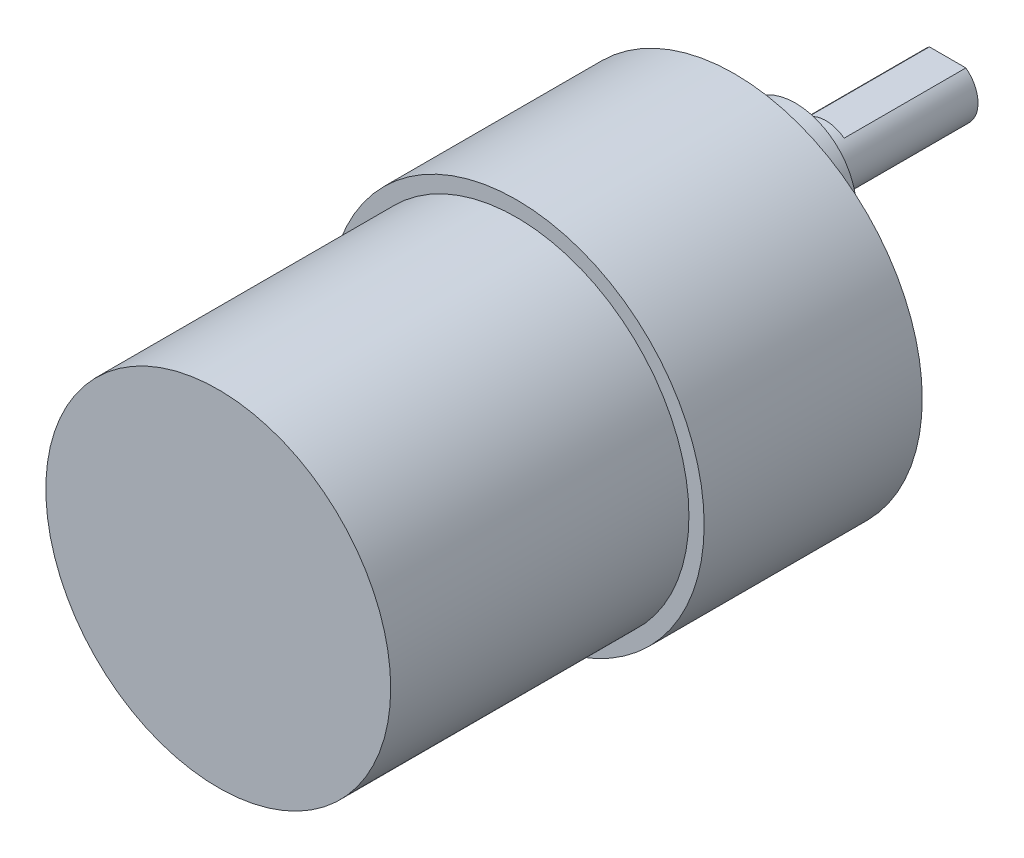
ISO-10303-21;
HEADER;
FILE_DESCRIPTION(('STEP AP214'),'2;1');
FILE_NAME('part.step','',(''),(''),'','','');
FILE_SCHEMA(('AUTOMOTIVE_DESIGN { 1 0 10303 214 1 1 1 1 }'));
ENDSEC;
DATA;
#1=APPLICATION_CONTEXT('core data for automotive mechanical design processes');
#2=APPLICATION_PROTOCOL_DEFINITION('international standard','automotive_design',2000,#1);
#3=PRODUCT_CONTEXT('',#1,'mechanical');
#4=PRODUCT('Part','Part','',(#3));
#5=PRODUCT_RELATED_PRODUCT_CATEGORY('part','',(#4));
#6=PRODUCT_DEFINITION_FORMATION('','',#4);
#7=PRODUCT_DEFINITION_CONTEXT('part definition',#1,'design');
#8=PRODUCT_DEFINITION('design','',#6,#7);
#9=PRODUCT_DEFINITION_SHAPE('','',#8);
#10=(LENGTH_UNIT() NAMED_UNIT(*) SI_UNIT(.MILLI.,.METRE.));
#11=(NAMED_UNIT(*) PLANE_ANGLE_UNIT() SI_UNIT($,.RADIAN.));
#12=(NAMED_UNIT(*) SI_UNIT($,.STERADIAN.) SOLID_ANGLE_UNIT());
#13=UNCERTAINTY_MEASURE_WITH_UNIT(LENGTH_MEASURE(1.E-05),#10,'distance_accuracy_value','');
#14=(GEOMETRIC_REPRESENTATION_CONTEXT(3) GLOBAL_UNCERTAINTY_ASSIGNED_CONTEXT((#13)) GLOBAL_UNIT_ASSIGNED_CONTEXT((#10,
#11,#12)) REPRESENTATION_CONTEXT('',''));
#15=CARTESIAN_POINT('',(0.,0.,0.));
#16=DIRECTION('',(0.,0.,1.));
#17=DIRECTION('',(1.,0.,0.));
#18=AXIS2_PLACEMENT_3D('',#15,#16,#17);
#19=CARTESIAN_POINT('',(0.,0.,0.));
#20=DIRECTION('',(0.,0.,1.));
#21=DIRECTION('',(1.,0.,0.));
#22=AXIS2_PLACEMENT_3D('',#19,#20,#21);
#23=PLANE('',#22);
#24=CARTESIAN_POINT('',(0.,-15.5,0.));
#25=DIRECTION('',(0.,0.,-1.));
#26=DIRECTION('',(-1.,0.,0.));
#27=AXIS2_PLACEMENT_3D('',#24,#25,#26);
#28=CIRCLE('',#27,2.);
#29=CARTESIAN_POINT('',(-2.,-15.5,0.));
#30=VERTEX_POINT('',#29);
#31=EDGE_CURVE('E435',#30,#30,#28,.T.);
#32=ORIENTED_EDGE('',*,*,#31,.F.);
#33=EDGE_LOOP('',(#32));
#34=FACE_BOUND('',#33,.T.);
#35=CARTESIAN_POINT('',(13.4233937586588,7.75000000000006,0.));
#36=DIRECTION('',(0.,0.,-1.));
#37=DIRECTION('',(-1.,0.,0.));
#38=AXIS2_PLACEMENT_3D('',#35,#36,#37);
#39=CIRCLE('',#38,2.);
#40=CARTESIAN_POINT('',(11.4233937586588,7.75000000000006,0.));
#41=VERTEX_POINT('',#40);
#42=EDGE_CURVE('E446',#41,#41,#39,.T.);
#43=ORIENTED_EDGE('',*,*,#42,.F.);
#44=EDGE_LOOP('',(#43));
#45=FACE_BOUND('',#44,.T.);
#46=CARTESIAN_POINT('',(-13.4233937586589,7.74999999999988,0.));
#47=DIRECTION('',(0.,0.,-1.));
#48=DIRECTION('',(-1.,0.,0.));
#49=AXIS2_PLACEMENT_3D('',#46,#47,#48);
#50=CIRCLE('',#49,2.);
#51=CARTESIAN_POINT('',(-15.4233937586589,7.74999999999988,0.));
#52=VERTEX_POINT('',#51);
#53=EDGE_CURVE('E452',#52,#52,#50,.T.);
#54=ORIENTED_EDGE('',*,*,#53,.F.);
#55=EDGE_LOOP('',(#54));
#56=FACE_BOUND('',#55,.T.);
#57=CARTESIAN_POINT('',(-7.74999999999987,-13.4233937586589,0.));
#58=DIRECTION('',(0.,0.,-1.));
#59=DIRECTION('',(1.,0.,0.));
#60=AXIS2_PLACEMENT_3D('',#57,#58,#59);
#61=CIRCLE('',#60,1.5);
#62=CARTESIAN_POINT('',(-6.24999999999987,-13.4233937586589,0.));
#63=VERTEX_POINT('',#62);
#64=EDGE_CURVE('E434',#63,#63,#61,.T.);
#65=ORIENTED_EDGE('',*,*,#64,.F.);
#66=EDGE_LOOP('',(#65));
#67=FACE_BOUND('',#66,.T.);
#68=CARTESIAN_POINT('',(7.74999999999987,13.4233937586589,0.));
#69=DIRECTION('',(0.,0.,-1.));
#70=DIRECTION('',(-1.,0.,0.));
#71=AXIS2_PLACEMENT_3D('',#68,#69,#70);
#72=CIRCLE('',#71,1.5);
#73=CARTESIAN_POINT('',(6.24999999999987,13.4233937586589,0.));
#74=VERTEX_POINT('',#73);
#75=EDGE_CURVE('E477',#74,#74,#72,.T.);
#76=ORIENTED_EDGE('',*,*,#75,.F.);
#77=EDGE_LOOP('',(#76));
#78=FACE_BOUND('',#77,.T.);
#79=CARTESIAN_POINT('',(-7.75000000000006,13.4233937586588,0.));
#80=DIRECTION('',(0.,0.,-1.));
#81=DIRECTION('',(1.,0.,0.));
#82=AXIS2_PLACEMENT_3D('',#79,#80,#81);
#83=CIRCLE('',#82,1.5);
#84=CARTESIAN_POINT('',(-6.25000000000006,13.4233937586588,0.));
#85=VERTEX_POINT('',#84);
#86=EDGE_CURVE('E471',#85,#85,#83,.T.);
#87=ORIENTED_EDGE('',*,*,#86,.F.);
#88=EDGE_LOOP('',(#87));
#89=FACE_BOUND('',#88,.T.);
#90=CARTESIAN_POINT('',(15.5,0.,0.));
#91=DIRECTION('',(0.,0.,-1.));
#92=DIRECTION('',(1.,0.,0.));
#93=AXIS2_PLACEMENT_3D('',#90,#91,#92);
#94=CIRCLE('',#93,1.5);
#95=CARTESIAN_POINT('',(17.,0.,0.));
#96=VERTEX_POINT('',#95);
#97=EDGE_CURVE('E465',#96,#96,#94,.T.);
#98=ORIENTED_EDGE('',*,*,#97,.F.);
#99=EDGE_LOOP('',(#98));
#100=FACE_BOUND('',#99,.T.);
#101=CARTESIAN_POINT('',(-15.5,0.,0.));
#102=DIRECTION('',(0.,0.,-1.));
#103=DIRECTION('',(-1.,0.,0.));
#104=AXIS2_PLACEMENT_3D('',#101,#102,#103);
#105=CIRCLE('',#104,1.5);
#106=CARTESIAN_POINT('',(-17.,0.,0.));
#107=VERTEX_POINT('',#106);
#108=EDGE_CURVE('E459',#107,#107,#105,.T.);
#109=ORIENTED_EDGE('',*,*,#108,.F.);
#110=EDGE_LOOP('',(#109));
#111=FACE_BOUND('',#110,.T.);
#112=CARTESIAN_POINT('',(7.75000000000006,-13.4233937586588,0.));
#113=DIRECTION('',(0.,0.,-1.));
#114=DIRECTION('',(-1.,0.,0.));
#115=AXIS2_PLACEMENT_3D('',#112,#113,#114);
#116=CIRCLE('',#115,1.5);
#117=CARTESIAN_POINT('',(6.25000000000006,-13.4233937586588,0.));
#118=VERTEX_POINT('',#117);
#119=EDGE_CURVE('E458',#118,#118,#116,.T.);
#120=ORIENTED_EDGE('',*,*,#119,.F.);
#121=EDGE_LOOP('',(#120));
#122=FACE_BOUND('',#121,.T.);
#123=CARTESIAN_POINT('',(0.,7.,0.));
#124=DIRECTION('',(0.,0.,1.));
#125=DIRECTION('',(1.,0.,0.));
#126=AXIS2_PLACEMENT_3D('',#123,#124,#125);
#127=CIRCLE('',#126,6.);
#128=CARTESIAN_POINT('',(6.,7.,0.));
#129=VERTEX_POINT('',#128);
#130=EDGE_CURVE('E42',#129,#129,#127,.F.);
#131=ORIENTED_EDGE('',*,*,#130,.F.);
#132=EDGE_LOOP('',(#131));
#133=FACE_BOUND('',#132,.T.);
#134=CARTESIAN_POINT('',(0.,0.,0.));
#135=DIRECTION('',(0.,0.,1.));
#136=DIRECTION('',(1.,0.,0.));
#137=AXIS2_PLACEMENT_3D('',#134,#135,#136);
#138=CIRCLE('',#137,18.5);
#139=CARTESIAN_POINT('',(18.5,0.,0.));
#140=VERTEX_POINT('',#139);
#141=EDGE_CURVE('E120',#140,#140,#138,.T.);
#142=ORIENTED_EDGE('',*,*,#141,.F.);
#143=EDGE_LOOP('',(#142));
#144=FACE_BOUND('',#143,.T.);
#145=CARTESIAN_POINT('',(0.,7.,0.));
#146=DIRECTION('',(0.,0.,-1.));
#147=DIRECTION('',(-1.,0.,0.));
#148=AXIS2_PLACEMENT_3D('',#145,#146,#147);
#149=CIRCLE('',#148,11.5);
#150=CARTESIAN_POINT('',(11.3605116297549,5.21428571428572,0.));
#151=VERTEX_POINT('',#150);
#152=CARTESIAN_POINT('',(-11.3605116297549,5.21428571428572,0.));
#153=VERTEX_POINT('',#152);
#154=EDGE_CURVE('E62',#151,#153,#149,.T.);
#155=ORIENTED_EDGE('',*,*,#154,.T.);
#156=CARTESIAN_POINT('',(0.,0.,0.));
#157=DIRECTION('',(0.,0.,-1.));
#158=DIRECTION('',(-1.,0.,0.));
#159=AXIS2_PLACEMENT_3D('',#156,#157,#158);
#160=CIRCLE('',#159,12.5);
#161=EDGE_CURVE('E107',#151,#153,#160,.T.);
#162=ORIENTED_EDGE('',*,*,#161,.F.);
#163=EDGE_LOOP('',(#155,#162));
#164=FACE_BOUND('',#163,.T.);
#165=ADVANCED_FACE('F38',(#34,#45,#56,#67,#78,#89,#100,#111,#122,#133,#144,#164),#23,.F.);
#166=CARTESIAN_POINT('',(0.,0.,21.5));
#167=DIRECTION('',(0.,0.,-1.));
#168=DIRECTION('',(-1.,0.,0.));
#169=AXIS2_PLACEMENT_3D('',#166,#167,#168);
#170=CYLINDRICAL_SURFACE('',#169,18.5);
#171=CARTESIAN_POINT('',(0.,0.,21.5));
#172=DIRECTION('',(0.,0.,1.));
#173=DIRECTION('',(1.,0.,0.));
#174=AXIS2_PLACEMENT_3D('',#171,#172,#173);
#175=CIRCLE('',#174,18.5);
#176=CARTESIAN_POINT('',(18.5,0.,21.5));
#177=VERTEX_POINT('',#176);
#178=EDGE_CURVE('E124',#177,#177,#175,.T.);
#179=ORIENTED_EDGE('',*,*,#178,.F.);
#180=EDGE_LOOP('',(#179));
#181=FACE_BOUND('',#180,.T.);
#182=ORIENTED_EDGE('',*,*,#141,.T.);
#183=EDGE_LOOP('',(#182));
#184=FACE_BOUND('',#183,.T.);
#185=ADVANCED_FACE('F40',(#181,#184),#170,.T.);
#186=CARTESIAN_POINT('',(0.,0.,21.5));
#187=DIRECTION('',(0.,0.,1.));
#188=DIRECTION('',(1.,0.,0.));
#189=AXIS2_PLACEMENT_3D('',#186,#187,#188);
#190=PLANE('',#189);
#191=CARTESIAN_POINT('',(0.,0.,21.5));
#192=DIRECTION('',(0.,0.,1.));
#193=DIRECTION('',(1.,0.,0.));
#194=AXIS2_PLACEMENT_3D('',#191,#192,#193);
#195=CIRCLE('',#194,17.);
#196=CARTESIAN_POINT('',(17.,0.,21.5));
#197=VERTEX_POINT('',#196);
#198=EDGE_CURVE('E121',#197,#197,#195,.T.);
#199=ORIENTED_EDGE('',*,*,#198,.F.);
#200=EDGE_LOOP('',(#199));
#201=FACE_BOUND('',#200,.T.);
#202=ORIENTED_EDGE('',*,*,#178,.T.);
#203=EDGE_LOOP('',(#202));
#204=FACE_BOUND('',#203,.T.);
#205=ADVANCED_FACE('F164',(#201,#204),#190,.T.);
#206=CARTESIAN_POINT('',(0.,0.,50.9));
#207=DIRECTION('',(0.,0.,-1.));
#208=DIRECTION('',(-1.,0.,0.));
#209=AXIS2_PLACEMENT_3D('',#206,#207,#208);
#210=CYLINDRICAL_SURFACE('',#209,17.);
#211=CARTESIAN_POINT('',(0.,0.,50.9));
#212=DIRECTION('',(0.,0.,1.));
#213=DIRECTION('',(1.,0.,0.));
#214=AXIS2_PLACEMENT_3D('',#211,#212,#213);
#215=CIRCLE('',#214,17.);
#216=CARTESIAN_POINT('',(17.,0.,50.9));
#217=VERTEX_POINT('',#216);
#218=EDGE_CURVE('E116',#217,#217,#215,.T.);
#219=ORIENTED_EDGE('',*,*,#218,.F.);
#220=EDGE_LOOP('',(#219));
#221=FACE_BOUND('',#220,.T.);
#222=ORIENTED_EDGE('',*,*,#198,.T.);
#223=EDGE_LOOP('',(#222));
#224=FACE_BOUND('',#223,.T.);
#225=ADVANCED_FACE('F160',(#221,#224),#210,.T.);
#226=CARTESIAN_POINT('',(0.,0.,50.9));
#227=DIRECTION('',(0.,0.,1.));
#228=DIRECTION('',(1.,0.,0.));
#229=AXIS2_PLACEMENT_3D('',#226,#227,#228);
#230=PLANE('',#229);
#231=ORIENTED_EDGE('',*,*,#218,.T.);
#232=EDGE_LOOP('',(#231));
#233=FACE_BOUND('',#232,.T.);
#234=ADVANCED_FACE('F157',(#233),#230,.T.);
#235=CARTESIAN_POINT('',(0.,7.,1.));
#236=DIRECTION('',(0.,0.,-1.));
#237=DIRECTION('',(-1.,0.,0.));
#238=AXIS2_PLACEMENT_3D('',#235,#236,#237);
#239=CYLINDRICAL_SURFACE('',#238,11.5);
#240=ORIENTED_EDGE('',*,*,#154,.F.);
#241=DIRECTION('',(0.,0.,-1.));
#242=VECTOR('',#241,1.);
#243=CARTESIAN_POINT('',(11.3605116297549,5.21428571428572,1.));
#244=LINE('',#243,#242);
#245=CARTESIAN_POINT('',(11.3605116297549,5.21428571428572,1.));
#246=VERTEX_POINT('',#245);
#247=EDGE_CURVE('E110',#246,#151,#244,.T.);
#248=ORIENTED_EDGE('',*,*,#247,.F.);
#249=CARTESIAN_POINT('',(0.,7.,1.));
#250=DIRECTION('',(0.,0.,-1.));
#251=DIRECTION('',(-1.,0.,0.));
#252=AXIS2_PLACEMENT_3D('',#249,#250,#251);
#253=CIRCLE('',#252,11.5);
#254=CARTESIAN_POINT('',(-11.3605116297549,5.21428571428572,1.));
#255=VERTEX_POINT('',#254);
#256=EDGE_CURVE('E104',#246,#255,#253,.T.);
#257=ORIENTED_EDGE('',*,*,#256,.T.);
#258=DIRECTION('',(0.,0.,-1.));
#259=VECTOR('',#258,1.);
#260=CARTESIAN_POINT('',(-11.3605116297549,5.21428571428572,1.));
#261=LINE('',#260,#259);
#262=EDGE_CURVE('E114',#255,#153,#261,.T.);
#263=ORIENTED_EDGE('',*,*,#262,.T.);
#264=EDGE_LOOP('',(#240,#248,#257,#263));
#265=FACE_BOUND('',#264,.T.);
#266=ADVANCED_FACE('F139',(#265),#239,.T.);
#267=CARTESIAN_POINT('',(0.,0.,1.));
#268=DIRECTION('',(0.,0.,-1.));
#269=DIRECTION('',(-1.,0.,0.));
#270=AXIS2_PLACEMENT_3D('',#267,#268,#269);
#271=CYLINDRICAL_SURFACE('',#270,12.5);
#272=ORIENTED_EDGE('',*,*,#161,.T.);
#273=ORIENTED_EDGE('',*,*,#262,.F.);
#274=CARTESIAN_POINT('',(0.,0.,1.));
#275=DIRECTION('',(0.,0.,-1.));
#276=DIRECTION('',(-1.,0.,0.));
#277=AXIS2_PLACEMENT_3D('',#274,#275,#276);
#278=CIRCLE('',#277,12.5);
#279=EDGE_CURVE('E106',#246,#255,#278,.T.);
#280=ORIENTED_EDGE('',*,*,#279,.F.);
#281=ORIENTED_EDGE('',*,*,#247,.T.);
#282=EDGE_LOOP('',(#272,#273,#280,#281));
#283=FACE_BOUND('',#282,.T.);
#284=ADVANCED_FACE('F136',(#283),#271,.F.);
#285=CARTESIAN_POINT('',(0.,0.,1.));
#286=DIRECTION('',(0.,0.,-1.));
#287=DIRECTION('',(-1.,0.,0.));
#288=AXIS2_PLACEMENT_3D('',#285,#286,#287);
#289=PLANE('',#288);
#290=ORIENTED_EDGE('',*,*,#256,.F.);
#291=ORIENTED_EDGE('',*,*,#279,.T.);
#292=EDGE_LOOP('',(#290,#291));
#293=FACE_BOUND('',#292,.T.);
#294=ADVANCED_FACE('F141',(#293),#289,.T.);
#295=CARTESIAN_POINT('',(0.,7.,-6.));
#296=DIRECTION('',(0.,0.,1.));
#297=DIRECTION('',(1.,0.,0.));
#298=AXIS2_PLACEMENT_3D('',#295,#296,#297);
#299=CYLINDRICAL_SURFACE('',#298,6.);
#300=CARTESIAN_POINT('',(0.,7.,-6.));
#301=DIRECTION('',(0.,0.,-1.));
#302=DIRECTION('',(-1.,0.,0.));
#303=AXIS2_PLACEMENT_3D('',#300,#301,#302);
#304=CIRCLE('',#303,6.);
#305=CARTESIAN_POINT('',(-6.,7.,-6.));
#306=VERTEX_POINT('',#305);
#307=EDGE_CURVE('E100',#306,#306,#304,.T.);
#308=ORIENTED_EDGE('',*,*,#307,.F.);
#309=EDGE_LOOP('',(#308));
#310=FACE_BOUND('',#309,.T.);
#311=ORIENTED_EDGE('',*,*,#130,.T.);
#312=EDGE_LOOP('',(#311));
#313=FACE_BOUND('',#312,.T.);
#314=ADVANCED_FACE('F143',(#310,#313),#299,.T.);
#315=CARTESIAN_POINT('',(0.,7.,-6.));
#316=DIRECTION('',(0.,0.,-1.));
#317=DIRECTION('',(-1.,0.,0.));
#318=AXIS2_PLACEMENT_3D('',#315,#316,#317);
#319=PLANE('',#318);
#320=CARTESIAN_POINT('',(0.,7.,-6.));
#321=DIRECTION('',(0.,0.,-1.));
#322=DIRECTION('',(-1.,0.,0.));
#323=AXIS2_PLACEMENT_3D('',#320,#321,#322);
#324=CIRCLE('',#323,3.);
#325=CARTESIAN_POINT('',(-3.,7.,-6.));
#326=VERTEX_POINT('',#325);
#327=EDGE_CURVE('E11',#326,#326,#324,.T.);
#328=ORIENTED_EDGE('',*,*,#327,.F.);
#329=EDGE_LOOP('',(#328));
#330=FACE_BOUND('',#329,.T.);
#331=ORIENTED_EDGE('',*,*,#307,.T.);
#332=EDGE_LOOP('',(#331));
#333=FACE_BOUND('',#332,.T.);
#334=ADVANCED_FACE('F149',(#330,#333),#319,.T.);
#335=CARTESIAN_POINT('',(0.,7.,-21.));
#336=DIRECTION('',(0.,0.,1.));
#337=DIRECTION('',(1.,0.,0.));
#338=AXIS2_PLACEMENT_3D('',#335,#336,#337);
#339=CYLINDRICAL_SURFACE('',#338,3.);
#340=CARTESIAN_POINT('',(0.,7.,-21.));
#341=DIRECTION('',(0.,0.,-1.));
#342=DIRECTION('',(-1.,0.,0.));
#343=AXIS2_PLACEMENT_3D('',#340,#341,#342);
#344=CIRCLE('',#343,3.);
#345=CARTESIAN_POINT('',(1.8,9.4,-21.));
#346=VERTEX_POINT('',#345);
#347=CARTESIAN_POINT('',(-1.8,9.4,-21.));
#348=VERTEX_POINT('',#347);
#349=EDGE_CURVE('E95',#346,#348,#344,.T.);
#350=ORIENTED_EDGE('',*,*,#349,.F.);
#351=DIRECTION('',(0.,0.,-1.));
#352=VECTOR('',#351,1.);
#353=CARTESIAN_POINT('',(1.8,9.4,-9.));
#354=LINE('',#353,#352);
#355=CARTESIAN_POINT('',(1.8,9.4,-9.));
#356=VERTEX_POINT('',#355);
#357=EDGE_CURVE('E54',#356,#346,#354,.T.);
#358=ORIENTED_EDGE('',*,*,#357,.F.);
#359=CARTESIAN_POINT('',(0.,7.,-9.));
#360=DIRECTION('',(0.,0.,-1.));
#361=DIRECTION('',(-1.,0.,0.));
#362=AXIS2_PLACEMENT_3D('',#359,#360,#361);
#363=CIRCLE('',#362,3.);
#364=CARTESIAN_POINT('',(-1.8,9.4,-9.));
#365=VERTEX_POINT('',#364);
#366=EDGE_CURVE('E85',#365,#356,#363,.T.);
#367=ORIENTED_EDGE('',*,*,#366,.F.);
#368=DIRECTION('',(0.,0.,-1.));
#369=VECTOR('',#368,1.);
#370=CARTESIAN_POINT('',(-1.8,9.4,-9.));
#371=LINE('',#370,#369);
#372=EDGE_CURVE('E82',#365,#348,#371,.T.);
#373=ORIENTED_EDGE('',*,*,#372,.T.);
#374=EDGE_LOOP('',(#350,#358,#367,#373));
#375=FACE_BOUND('',#374,.T.);
#376=ORIENTED_EDGE('',*,*,#327,.T.);
#377=EDGE_LOOP('',(#376));
#378=FACE_BOUND('',#377,.T.);
#379=ADVANCED_FACE('F92',(#375,#378),#339,.T.);
#380=CARTESIAN_POINT('',(0.,7.,-21.));
#381=DIRECTION('',(0.,0.,-1.));
#382=DIRECTION('',(-1.,0.,0.));
#383=AXIS2_PLACEMENT_3D('',#380,#381,#382);
#384=PLANE('',#383);
#385=DIRECTION('',(-1.,0.,0.));
#386=VECTOR('',#385,1.);
#387=CARTESIAN_POINT('',(0.,9.4,-21.));
#388=LINE('',#387,#386);
#389=EDGE_CURVE('E89',#346,#348,#388,.T.);
#390=ORIENTED_EDGE('',*,*,#389,.F.);
#391=ORIENTED_EDGE('',*,*,#349,.T.);
#392=EDGE_LOOP('',(#390,#391));
#393=FACE_BOUND('',#392,.T.);
#394=ADVANCED_FACE('F221',(#393),#384,.T.);
#395=CARTESIAN_POINT('',(0.,9.4,-9.));
#396=DIRECTION('',(0.,-1.,0.));
#397=DIRECTION('',(0.,0.,-1.));
#398=AXIS2_PLACEMENT_3D('',#395,#396,#397);
#399=PLANE('',#398);
#400=ORIENTED_EDGE('',*,*,#389,.T.);
#401=ORIENTED_EDGE('',*,*,#372,.F.);
#402=DIRECTION('',(-1.,0.,0.));
#403=VECTOR('',#402,1.);
#404=CARTESIAN_POINT('',(0.,9.4,-9.));
#405=LINE('',#404,#403);
#406=EDGE_CURVE('E78',#356,#365,#405,.T.);
#407=ORIENTED_EDGE('',*,*,#406,.F.);
#408=ORIENTED_EDGE('',*,*,#357,.T.);
#409=EDGE_LOOP('',(#400,#401,#407,#408));
#410=FACE_BOUND('',#409,.T.);
#411=ADVANCED_FACE('F80',(#410),#399,.F.);
#412=CARTESIAN_POINT('',(0.,7.,-9.));
#413=DIRECTION('',(0.,0.,-1.));
#414=DIRECTION('',(-1.,0.,0.));
#415=AXIS2_PLACEMENT_3D('',#412,#413,#414);
#416=PLANE('',#415);
#417=ORIENTED_EDGE('',*,*,#366,.T.);
#418=ORIENTED_EDGE('',*,*,#406,.T.);
#419=EDGE_LOOP('',(#417,#418));
#420=FACE_BOUND('',#419,.T.);
#421=ADVANCED_FACE('F87',(#420),#416,.T.);
#422=CARTESIAN_POINT('',(7.75000000000006,-13.4233937586588,5.));
#423=DIRECTION('',(0.,0.,-1.));
#424=DIRECTION('',(-1.,0.,0.));
#425=AXIS2_PLACEMENT_3D('',#422,#423,#424);
#426=CYLINDRICAL_SURFACE('',#425,1.5);
#427=CARTESIAN_POINT('',(7.75000000000006,-13.4233937586588,5.));
#428=DIRECTION('',(0.,0.,-1.));
#429=DIRECTION('',(-1.,0.,0.));
#430=AXIS2_PLACEMENT_3D('',#427,#428,#429);
#431=CIRCLE('',#430,1.5);
#432=CARTESIAN_POINT('',(6.25000000000006,-13.4233937586588,5.));
#433=VERTEX_POINT('',#432);
#434=EDGE_CURVE('E482',#433,#433,#431,.T.);
#435=ORIENTED_EDGE('',*,*,#434,.F.);
#436=EDGE_LOOP('',(#435));
#437=FACE_BOUND('',#436,.T.);
#438=ORIENTED_EDGE('',*,*,#119,.T.);
#439=EDGE_LOOP('',(#438));
#440=FACE_BOUND('',#439,.T.);
#441=ADVANCED_FACE('F250',(#437,#440),#426,.F.);
#442=CARTESIAN_POINT('',(7.75000000000006,-13.4233937586588,5.));
#443=DIRECTION('',(0.,0.,-1.));
#444=DIRECTION('',(-1.,0.,0.));
#445=AXIS2_PLACEMENT_3D('',#442,#443,#444);
#446=PLANE('',#445);
#447=ORIENTED_EDGE('',*,*,#434,.T.);
#448=EDGE_LOOP('',(#447));
#449=FACE_BOUND('',#448,.T.);
#450=ADVANCED_FACE('F259',(#449),#446,.T.);
#451=CARTESIAN_POINT('',(-15.5,0.,5.));
#452=DIRECTION('',(0.,0.,-1.));
#453=DIRECTION('',(-1.,0.,0.));
#454=AXIS2_PLACEMENT_3D('',#451,#452,#453);
#455=CYLINDRICAL_SURFACE('',#454,1.5);
#456=CARTESIAN_POINT('',(-15.5,0.,5.));
#457=DIRECTION('',(0.,0.,-1.));
#458=DIRECTION('',(-1.,0.,0.));
#459=AXIS2_PLACEMENT_3D('',#456,#457,#458);
#460=CIRCLE('',#459,1.5);
#461=CARTESIAN_POINT('',(-17.,0.,5.));
#462=VERTEX_POINT('',#461);
#463=EDGE_CURVE('E455',#462,#462,#460,.T.);
#464=ORIENTED_EDGE('',*,*,#463,.F.);
#465=EDGE_LOOP('',(#464));
#466=FACE_BOUND('',#465,.T.);
#467=ORIENTED_EDGE('',*,*,#108,.T.);
#468=EDGE_LOOP('',(#467));
#469=FACE_BOUND('',#468,.T.);
#470=ADVANCED_FACE('F269',(#466,#469),#455,.F.);
#471=CARTESIAN_POINT('',(-15.5,0.,5.));
#472=DIRECTION('',(0.,0.,-1.));
#473=DIRECTION('',(-1.,0.,0.));
#474=AXIS2_PLACEMENT_3D('',#471,#472,#473);
#475=PLANE('',#474);
#476=ORIENTED_EDGE('',*,*,#463,.T.);
#477=EDGE_LOOP('',(#476));
#478=FACE_BOUND('',#477,.T.);
#479=ADVANCED_FACE('F279',(#478),#475,.T.);
#480=CARTESIAN_POINT('',(15.5,0.,5.));
#481=DIRECTION('',(0.,0.,-1.));
#482=DIRECTION('',(-1.,0.,0.));
#483=AXIS2_PLACEMENT_3D('',#480,#481,#482);
#484=CYLINDRICAL_SURFACE('',#483,1.5);
#485=CARTESIAN_POINT('',(15.5,0.,5.));
#486=DIRECTION('',(0.,0.,-1.));
#487=DIRECTION('',(1.,0.,0.));
#488=AXIS2_PLACEMENT_3D('',#485,#486,#487);
#489=CIRCLE('',#488,1.5);
#490=CARTESIAN_POINT('',(17.,0.,5.));
#491=VERTEX_POINT('',#490);
#492=EDGE_CURVE('E462',#491,#491,#489,.T.);
#493=ORIENTED_EDGE('',*,*,#492,.F.);
#494=EDGE_LOOP('',(#493));
#495=FACE_BOUND('',#494,.T.);
#496=ORIENTED_EDGE('',*,*,#97,.T.);
#497=EDGE_LOOP('',(#496));
#498=FACE_BOUND('',#497,.T.);
#499=ADVANCED_FACE('F289',(#495,#498),#484,.F.);
#500=CARTESIAN_POINT('',(15.5,0.,5.));
#501=DIRECTION('',(0.,0.,1.));
#502=DIRECTION('',(1.,0.,0.));
#503=AXIS2_PLACEMENT_3D('',#500,#501,#502);
#504=PLANE('',#503);
#505=ORIENTED_EDGE('',*,*,#492,.T.);
#506=EDGE_LOOP('',(#505));
#507=FACE_BOUND('',#506,.T.);
#508=ADVANCED_FACE('F299',(#507),#504,.F.);
#509=CARTESIAN_POINT('',(-7.75000000000006,13.4233937586588,5.));
#510=DIRECTION('',(0.,0.,-1.));
#511=DIRECTION('',(-1.,0.,0.));
#512=AXIS2_PLACEMENT_3D('',#509,#510,#511);
#513=CYLINDRICAL_SURFACE('',#512,1.5);
#514=CARTESIAN_POINT('',(-7.75000000000006,13.4233937586588,5.));
#515=DIRECTION('',(0.,0.,-1.));
#516=DIRECTION('',(1.,0.,0.));
#517=AXIS2_PLACEMENT_3D('',#514,#515,#516);
#518=CIRCLE('',#517,1.5);
#519=CARTESIAN_POINT('',(-6.25000000000006,13.4233937586588,5.));
#520=VERTEX_POINT('',#519);
#521=EDGE_CURVE('E468',#520,#520,#518,.T.);
#522=ORIENTED_EDGE('',*,*,#521,.F.);
#523=EDGE_LOOP('',(#522));
#524=FACE_BOUND('',#523,.T.);
#525=ORIENTED_EDGE('',*,*,#86,.T.);
#526=EDGE_LOOP('',(#525));
#527=FACE_BOUND('',#526,.T.);
#528=ADVANCED_FACE('F309',(#524,#527),#513,.F.);
#529=CARTESIAN_POINT('',(-7.75000000000006,13.4233937586588,5.));
#530=DIRECTION('',(0.,0.,1.));
#531=DIRECTION('',(1.,0.,0.));
#532=AXIS2_PLACEMENT_3D('',#529,#530,#531);
#533=PLANE('',#532);
#534=ORIENTED_EDGE('',*,*,#521,.T.);
#535=EDGE_LOOP('',(#534));
#536=FACE_BOUND('',#535,.T.);
#537=ADVANCED_FACE('F319',(#536),#533,.F.);
#538=CARTESIAN_POINT('',(7.74999999999987,13.4233937586589,5.));
#539=DIRECTION('',(0.,0.,-1.));
#540=DIRECTION('',(-1.,0.,0.));
#541=AXIS2_PLACEMENT_3D('',#538,#539,#540);
#542=CYLINDRICAL_SURFACE('',#541,1.5);
#543=CARTESIAN_POINT('',(7.74999999999987,13.4233937586589,5.));
#544=DIRECTION('',(0.,0.,-1.));
#545=DIRECTION('',(-1.,0.,0.));
#546=AXIS2_PLACEMENT_3D('',#543,#544,#545);
#547=CIRCLE('',#546,1.5);
#548=CARTESIAN_POINT('',(6.24999999999987,13.4233937586589,5.));
#549=VERTEX_POINT('',#548);
#550=EDGE_CURVE('E474',#549,#549,#547,.T.);
#551=ORIENTED_EDGE('',*,*,#550,.F.);
#552=EDGE_LOOP('',(#551));
#553=FACE_BOUND('',#552,.T.);
#554=ORIENTED_EDGE('',*,*,#75,.T.);
#555=EDGE_LOOP('',(#554));
#556=FACE_BOUND('',#555,.T.);
#557=ADVANCED_FACE('F329',(#553,#556),#542,.F.);
#558=CARTESIAN_POINT('',(7.74999999999987,13.4233937586589,5.));
#559=DIRECTION('',(0.,0.,-1.));
#560=DIRECTION('',(-1.,0.,0.));
#561=AXIS2_PLACEMENT_3D('',#558,#559,#560);
#562=PLANE('',#561);
#563=ORIENTED_EDGE('',*,*,#550,.T.);
#564=EDGE_LOOP('',(#563));
#565=FACE_BOUND('',#564,.T.);
#566=ADVANCED_FACE('F339',(#565),#562,.T.);
#567=CARTESIAN_POINT('',(-7.74999999999987,-13.4233937586589,5.));
#568=DIRECTION('',(0.,0.,-1.));
#569=DIRECTION('',(-1.,0.,0.));
#570=AXIS2_PLACEMENT_3D('',#567,#568,#569);
#571=CYLINDRICAL_SURFACE('',#570,1.5);
#572=CARTESIAN_POINT('',(-7.74999999999987,-13.4233937586589,5.));
#573=DIRECTION('',(0.,0.,-1.));
#574=DIRECTION('',(1.,0.,0.));
#575=AXIS2_PLACEMENT_3D('',#572,#573,#574);
#576=CIRCLE('',#575,1.5);
#577=CARTESIAN_POINT('',(-6.24999999999987,-13.4233937586589,5.));
#578=VERTEX_POINT('',#577);
#579=EDGE_CURVE('E438',#578,#578,#576,.T.);
#580=ORIENTED_EDGE('',*,*,#579,.F.);
#581=EDGE_LOOP('',(#580));
#582=FACE_BOUND('',#581,.T.);
#583=ORIENTED_EDGE('',*,*,#64,.T.);
#584=EDGE_LOOP('',(#583));
#585=FACE_BOUND('',#584,.T.);
#586=ADVANCED_FACE('F349',(#582,#585),#571,.F.);
#587=CARTESIAN_POINT('',(-7.74999999999987,-13.4233937586589,5.));
#588=DIRECTION('',(0.,0.,1.));
#589=DIRECTION('',(1.,0.,0.));
#590=AXIS2_PLACEMENT_3D('',#587,#588,#589);
#591=PLANE('',#590);
#592=ORIENTED_EDGE('',*,*,#579,.T.);
#593=EDGE_LOOP('',(#592));
#594=FACE_BOUND('',#593,.T.);
#595=ADVANCED_FACE('F358',(#594),#591,.F.);
#596=CARTESIAN_POINT('',(-13.4233937586589,7.74999999999988,1.));
#597=DIRECTION('',(0.,0.,-1.));
#598=DIRECTION('',(-1.,0.,0.));
#599=AXIS2_PLACEMENT_3D('',#596,#597,#598);
#600=CYLINDRICAL_SURFACE('',#599,2.);
#601=CARTESIAN_POINT('',(-13.4233937586589,7.74999999999988,1.));
#602=DIRECTION('',(0.,0.,-1.));
#603=DIRECTION('',(-1.,0.,0.));
#604=AXIS2_PLACEMENT_3D('',#601,#602,#603);
#605=CIRCLE('',#604,2.);
#606=CARTESIAN_POINT('',(-15.4233937586589,7.74999999999988,1.));
#607=VERTEX_POINT('',#606);
#608=EDGE_CURVE('E449',#607,#607,#605,.T.);
#609=ORIENTED_EDGE('',*,*,#608,.F.);
#610=EDGE_LOOP('',(#609));
#611=FACE_BOUND('',#610,.T.);
#612=ORIENTED_EDGE('',*,*,#53,.T.);
#613=EDGE_LOOP('',(#612));
#614=FACE_BOUND('',#613,.T.);
#615=ADVANCED_FACE('F367',(#611,#614),#600,.F.);
#616=CARTESIAN_POINT('',(-13.4233937586589,7.74999999999988,1.));
#617=DIRECTION('',(0.,0.,-1.));
#618=DIRECTION('',(-1.,0.,0.));
#619=AXIS2_PLACEMENT_3D('',#616,#617,#618);
#620=PLANE('',#619);
#621=ORIENTED_EDGE('',*,*,#608,.T.);
#622=EDGE_LOOP('',(#621));
#623=FACE_BOUND('',#622,.T.);
#624=ADVANCED_FACE('F377',(#623),#620,.T.);
#625=CARTESIAN_POINT('',(13.4233937586588,7.75000000000006,1.));
#626=DIRECTION('',(0.,0.,-1.));
#627=DIRECTION('',(-1.,0.,0.));
#628=AXIS2_PLACEMENT_3D('',#625,#626,#627);
#629=CYLINDRICAL_SURFACE('',#628,2.);
#630=CARTESIAN_POINT('',(13.4233937586588,7.75000000000006,1.));
#631=DIRECTION('',(0.,0.,-1.));
#632=DIRECTION('',(-1.,0.,0.));
#633=AXIS2_PLACEMENT_3D('',#630,#631,#632);
#634=CIRCLE('',#633,2.);
#635=CARTESIAN_POINT('',(11.4233937586588,7.75000000000006,1.));
#636=VERTEX_POINT('',#635);
#637=EDGE_CURVE('E441',#636,#636,#634,.T.);
#638=ORIENTED_EDGE('',*,*,#637,.F.);
#639=EDGE_LOOP('',(#638));
#640=FACE_BOUND('',#639,.T.);
#641=ORIENTED_EDGE('',*,*,#42,.T.);
#642=EDGE_LOOP('',(#641));
#643=FACE_BOUND('',#642,.T.);
#644=ADVANCED_FACE('F384',(#640,#643),#629,.F.);
#645=CARTESIAN_POINT('',(13.4233937586588,7.75000000000006,1.));
#646=DIRECTION('',(0.,0.,-1.));
#647=DIRECTION('',(-1.,0.,0.));
#648=AXIS2_PLACEMENT_3D('',#645,#646,#647);
#649=PLANE('',#648);
#650=ORIENTED_EDGE('',*,*,#637,.T.);
#651=EDGE_LOOP('',(#650));
#652=FACE_BOUND('',#651,.T.);
#653=ADVANCED_FACE('F392',(#652),#649,.T.);
#654=CARTESIAN_POINT('',(0.,-15.5,1.));
#655=DIRECTION('',(0.,0.,-1.));
#656=DIRECTION('',(-1.,0.,0.));
#657=AXIS2_PLACEMENT_3D('',#654,#655,#656);
#658=CYLINDRICAL_SURFACE('',#657,2.);
#659=CARTESIAN_POINT('',(0.,-15.5,1.));
#660=DIRECTION('',(0.,0.,-1.));
#661=DIRECTION('',(-1.,0.,0.));
#662=AXIS2_PLACEMENT_3D('',#659,#660,#661);
#663=CIRCLE('',#662,2.);
#664=CARTESIAN_POINT('',(-2.,-15.5,1.));
#665=VERTEX_POINT('',#664);
#666=EDGE_CURVE('E433',#665,#665,#663,.T.);
#667=ORIENTED_EDGE('',*,*,#666,.F.);
#668=EDGE_LOOP('',(#667));
#669=FACE_BOUND('',#668,.T.);
#670=ORIENTED_EDGE('',*,*,#31,.T.);
#671=EDGE_LOOP('',(#670));
#672=FACE_BOUND('',#671,.T.);
#673=ADVANCED_FACE('F400',(#669,#672),#658,.F.);
#674=CARTESIAN_POINT('',(0.,-15.5,1.));
#675=DIRECTION('',(0.,0.,-1.));
#676=DIRECTION('',(-1.,0.,0.));
#677=AXIS2_PLACEMENT_3D('',#674,#675,#676);
#678=PLANE('',#677);
#679=ORIENTED_EDGE('',*,*,#666,.T.);
#680=EDGE_LOOP('',(#679));
#681=FACE_BOUND('',#680,.T.);
#682=ADVANCED_FACE('F408',(#681),#678,.T.);
#683=CLOSED_SHELL('',(#165,#185,#205,#225,#234,#266,#284,#294,#314,#334,#379,#394,#411,#421,
#441,#450,#470,#479,#499,#508,#528,#537,#557,#566,#586,#595,#615,#624,#644,#653,#673,#682));
#684=MANIFOLD_SOLID_BREP('B2',#683);
#685=ADVANCED_BREP_SHAPE_REPRESENTATION('',(#18,#684),#14);
#686=SHAPE_DEFINITION_REPRESENTATION(#9,#685);
ENDSEC;
END-ISO-10303-21;
